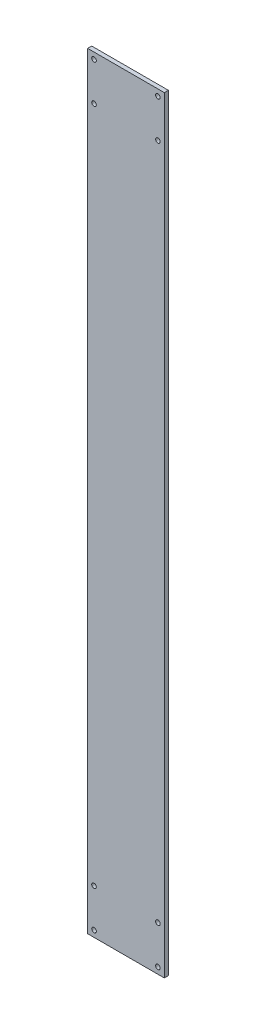
ISO-10303-21;
HEADER;
FILE_DESCRIPTION(('STEP AP214'),'2;1');
FILE_NAME('part.step','',(''),(''),'','','');
FILE_SCHEMA(('AUTOMOTIVE_DESIGN { 1 0 10303 214 1 1 1 1 }'));
ENDSEC;
DATA;
#1=APPLICATION_CONTEXT('core data for automotive mechanical design processes');
#2=APPLICATION_PROTOCOL_DEFINITION('international standard','automotive_design',2000,#1);
#3=PRODUCT_CONTEXT('',#1,'mechanical');
#4=PRODUCT('Part','Part','',(#3));
#5=PRODUCT_RELATED_PRODUCT_CATEGORY('part','',(#4));
#6=PRODUCT_DEFINITION_FORMATION('','',#4);
#7=PRODUCT_DEFINITION_CONTEXT('part definition',#1,'design');
#8=PRODUCT_DEFINITION('design','',#6,#7);
#9=PRODUCT_DEFINITION_SHAPE('','',#8);
#10=(LENGTH_UNIT() NAMED_UNIT(*) SI_UNIT(.MILLI.,.METRE.));
#11=(NAMED_UNIT(*) PLANE_ANGLE_UNIT() SI_UNIT($,.RADIAN.));
#12=(NAMED_UNIT(*) SI_UNIT($,.STERADIAN.) SOLID_ANGLE_UNIT());
#13=UNCERTAINTY_MEASURE_WITH_UNIT(LENGTH_MEASURE(1.E-05),#10,'distance_accuracy_value','');
#14=(GEOMETRIC_REPRESENTATION_CONTEXT(3) GLOBAL_UNCERTAINTY_ASSIGNED_CONTEXT((#13)) GLOBAL_UNIT_ASSIGNED_CONTEXT((#10,
#11,#12)) REPRESENTATION_CONTEXT('',''));
#15=CARTESIAN_POINT('',(0.,0.,0.));
#16=DIRECTION('',(0.,0.,1.));
#17=DIRECTION('',(1.,0.,0.));
#18=AXIS2_PLACEMENT_3D('',#15,#16,#17);
#19=CARTESIAN_POINT('',(30.,300.,3.175));
#20=DIRECTION('',(-1.,0.,0.));
#21=DIRECTION('',(0.,-1.,0.));
#22=AXIS2_PLACEMENT_3D('',#19,#20,#21);
#23=PLANE('',#22);
#24=DIRECTION('',(0.,1.,0.));
#25=VECTOR('',#24,1.);
#26=CARTESIAN_POINT('',(30.,300.,0.));
#27=LINE('',#26,#25);
#28=CARTESIAN_POINT('',(30.,-300.,0.));
#29=VERTEX_POINT('',#28);
#30=CARTESIAN_POINT('',(30.,300.,0.));
#31=VERTEX_POINT('',#30);
#32=EDGE_CURVE('E111',#29,#31,#27,.T.);
#33=ORIENTED_EDGE('',*,*,#32,.T.);
#34=DIRECTION('',(0.,0.,-1.));
#35=VECTOR('',#34,1.);
#36=CARTESIAN_POINT('',(30.,300.,3.175));
#37=LINE('',#36,#35);
#38=CARTESIAN_POINT('',(30.,300.,3.175));
#39=VERTEX_POINT('',#38);
#40=EDGE_CURVE('E11',#39,#31,#37,.T.);
#41=ORIENTED_EDGE('',*,*,#40,.F.);
#42=DIRECTION('',(0.,1.,0.));
#43=VECTOR('',#42,1.);
#44=CARTESIAN_POINT('',(30.,300.,3.175));
#45=LINE('',#44,#43);
#46=CARTESIAN_POINT('',(30.,-300.,3.175));
#47=VERTEX_POINT('',#46);
#48=EDGE_CURVE('E94',#47,#39,#45,.T.);
#49=ORIENTED_EDGE('',*,*,#48,.F.);
#50=DIRECTION('',(0.,0.,-1.));
#51=VECTOR('',#50,1.);
#52=CARTESIAN_POINT('',(30.,-300.,3.175));
#53=LINE('',#52,#51);
#54=EDGE_CURVE('E107',#47,#29,#53,.T.);
#55=ORIENTED_EDGE('',*,*,#54,.T.);
#56=EDGE_LOOP('',(#33,#41,#49,#55));
#57=FACE_BOUND('',#56,.T.);
#58=ADVANCED_FACE('F37',(#57),#23,.F.);
#59=CARTESIAN_POINT('',(-30.,300.,3.175));
#60=DIRECTION('',(0.,-1.,0.));
#61=DIRECTION('',(0.,0.,-1.));
#62=AXIS2_PLACEMENT_3D('',#59,#60,#61);
#63=PLANE('',#62);
#64=DIRECTION('',(-1.,0.,0.));
#65=VECTOR('',#64,1.);
#66=CARTESIAN_POINT('',(-30.,300.,0.));
#67=LINE('',#66,#65);
#68=CARTESIAN_POINT('',(-30.,300.,0.));
#69=VERTEX_POINT('',#68);
#70=EDGE_CURVE('E98',#31,#69,#67,.T.);
#71=ORIENTED_EDGE('',*,*,#70,.T.);
#72=DIRECTION('',(0.,0.,-1.));
#73=VECTOR('',#72,1.);
#74=CARTESIAN_POINT('',(-30.,300.,3.175));
#75=LINE('',#74,#73);
#76=CARTESIAN_POINT('',(-30.,300.,3.175));
#77=VERTEX_POINT('',#76);
#78=EDGE_CURVE('E46',#77,#69,#75,.T.);
#79=ORIENTED_EDGE('',*,*,#78,.F.);
#80=DIRECTION('',(-1.,0.,0.));
#81=VECTOR('',#80,1.);
#82=CARTESIAN_POINT('',(-30.,300.,3.175));
#83=LINE('',#82,#81);
#84=EDGE_CURVE('E89',#39,#77,#83,.T.);
#85=ORIENTED_EDGE('',*,*,#84,.F.);
#86=ORIENTED_EDGE('',*,*,#40,.T.);
#87=EDGE_LOOP('',(#71,#79,#85,#86));
#88=FACE_BOUND('',#87,.T.);
#89=ADVANCED_FACE('F97',(#88),#63,.F.);
#90=CARTESIAN_POINT('',(-30.,300.,3.175));
#91=DIRECTION('',(1.,0.,0.));
#92=DIRECTION('',(0.,1.,0.));
#93=AXIS2_PLACEMENT_3D('',#90,#91,#92);
#94=PLANE('',#93);
#95=DIRECTION('',(0.,-1.,0.));
#96=VECTOR('',#95,1.);
#97=CARTESIAN_POINT('',(-30.,300.,0.));
#98=LINE('',#97,#96);
#99=CARTESIAN_POINT('',(-30.,-300.,0.));
#100=VERTEX_POINT('',#99);
#101=EDGE_CURVE('E76',#69,#100,#98,.T.);
#102=ORIENTED_EDGE('',*,*,#101,.T.);
#103=DIRECTION('',(0.,0.,-1.));
#104=VECTOR('',#103,1.);
#105=CARTESIAN_POINT('',(-30.,-300.,3.175));
#106=LINE('',#105,#104);
#107=CARTESIAN_POINT('',(-30.,-300.,3.175));
#108=VERTEX_POINT('',#107);
#109=EDGE_CURVE('E99',#108,#100,#106,.T.);
#110=ORIENTED_EDGE('',*,*,#109,.F.);
#111=DIRECTION('',(0.,-1.,0.));
#112=VECTOR('',#111,1.);
#113=CARTESIAN_POINT('',(-30.,300.,3.175));
#114=LINE('',#113,#112);
#115=EDGE_CURVE('E92',#77,#108,#114,.T.);
#116=ORIENTED_EDGE('',*,*,#115,.F.);
#117=ORIENTED_EDGE('',*,*,#78,.T.);
#118=EDGE_LOOP('',(#102,#110,#116,#117));
#119=FACE_BOUND('',#118,.T.);
#120=ADVANCED_FACE('F101',(#119),#94,.F.);
#121=CARTESIAN_POINT('',(-30.,-300.,3.175));
#122=DIRECTION('',(0.,1.,0.));
#123=DIRECTION('',(0.,0.,1.));
#124=AXIS2_PLACEMENT_3D('',#121,#122,#123);
#125=PLANE('',#124);
#126=DIRECTION('',(1.,0.,0.));
#127=VECTOR('',#126,1.);
#128=CARTESIAN_POINT('',(-30.,-300.,0.));
#129=LINE('',#128,#127);
#130=EDGE_CURVE('E82',#100,#29,#129,.T.);
#131=ORIENTED_EDGE('',*,*,#130,.T.);
#132=ORIENTED_EDGE('',*,*,#54,.F.);
#133=DIRECTION('',(1.,0.,0.));
#134=VECTOR('',#133,1.);
#135=CARTESIAN_POINT('',(-30.,-300.,3.175));
#136=LINE('',#135,#134);
#137=EDGE_CURVE('E57',#108,#47,#136,.T.);
#138=ORIENTED_EDGE('',*,*,#137,.F.);
#139=ORIENTED_EDGE('',*,*,#109,.T.);
#140=EDGE_LOOP('',(#131,#132,#138,#139));
#141=FACE_BOUND('',#140,.T.);
#142=ADVANCED_FACE('F203',(#141),#125,.F.);
#143=CARTESIAN_POINT('',(0.,0.,3.175));
#144=DIRECTION('',(0.,0.,1.));
#145=DIRECTION('',(1.,0.,0.));
#146=AXIS2_PLACEMENT_3D('',#143,#144,#145);
#147=PLANE('',#146);
#148=CARTESIAN_POINT('',(25.,-295.,3.175));
#149=DIRECTION('',(0.,0.,1.));
#150=DIRECTION('',(1.,0.,0.));
#151=AXIS2_PLACEMENT_3D('',#148,#149,#150);
#152=CIRCLE('',#151,1.79999999999999);
#153=CARTESIAN_POINT('',(26.8,-295.,3.175));
#154=VERTEX_POINT('',#153);
#155=EDGE_CURVE('E157',#154,#154,#152,.T.);
#156=ORIENTED_EDGE('',*,*,#155,.F.);
#157=EDGE_LOOP('',(#156));
#158=FACE_BOUND('',#157,.T.);
#159=CARTESIAN_POINT('',(-25.,-265.,3.175));
#160=DIRECTION('',(0.,0.,1.));
#161=DIRECTION('',(1.,0.,0.));
#162=AXIS2_PLACEMENT_3D('',#159,#160,#161);
#163=CIRCLE('',#162,1.79999999999999);
#164=CARTESIAN_POINT('',(-23.2,-265.,3.175));
#165=VERTEX_POINT('',#164);
#166=EDGE_CURVE('E143',#165,#165,#163,.T.);
#167=ORIENTED_EDGE('',*,*,#166,.F.);
#168=EDGE_LOOP('',(#167));
#169=FACE_BOUND('',#168,.T.);
#170=CARTESIAN_POINT('',(-25.,-295.,3.175));
#171=DIRECTION('',(0.,0.,1.));
#172=DIRECTION('',(1.,0.,0.));
#173=AXIS2_PLACEMENT_3D('',#170,#171,#172);
#174=CIRCLE('',#173,1.79999999999999);
#175=CARTESIAN_POINT('',(-23.2,-295.,3.175));
#176=VERTEX_POINT('',#175);
#177=EDGE_CURVE('E142',#176,#176,#174,.T.);
#178=ORIENTED_EDGE('',*,*,#177,.F.);
#179=EDGE_LOOP('',(#178));
#180=FACE_BOUND('',#179,.T.);
#181=CARTESIAN_POINT('',(25.,-265.,3.175));
#182=DIRECTION('',(0.,0.,1.));
#183=DIRECTION('',(1.,0.,0.));
#184=AXIS2_PLACEMENT_3D('',#181,#182,#183);
#185=CIRCLE('',#184,1.79999999999999);
#186=CARTESIAN_POINT('',(26.8,-265.,3.175));
#187=VERTEX_POINT('',#186);
#188=EDGE_CURVE('E138',#187,#187,#185,.T.);
#189=ORIENTED_EDGE('',*,*,#188,.F.);
#190=EDGE_LOOP('',(#189));
#191=FACE_BOUND('',#190,.T.);
#192=CARTESIAN_POINT('',(-25.,265.,3.175));
#193=DIRECTION('',(0.,0.,1.));
#194=DIRECTION('',(1.,0.,0.));
#195=AXIS2_PLACEMENT_3D('',#192,#193,#194);
#196=CIRCLE('',#195,1.79999999999999);
#197=CARTESIAN_POINT('',(-23.2,265.,3.175));
#198=VERTEX_POINT('',#197);
#199=EDGE_CURVE('E134',#198,#198,#196,.T.);
#200=ORIENTED_EDGE('',*,*,#199,.F.);
#201=EDGE_LOOP('',(#200));
#202=FACE_BOUND('',#201,.T.);
#203=CARTESIAN_POINT('',(-25.,295.,3.175));
#204=DIRECTION('',(0.,0.,1.));
#205=DIRECTION('',(1.,0.,0.));
#206=AXIS2_PLACEMENT_3D('',#203,#204,#205);
#207=CIRCLE('',#206,1.79999999999999);
#208=CARTESIAN_POINT('',(-23.2,295.,3.175));
#209=VERTEX_POINT('',#208);
#210=EDGE_CURVE('E133',#209,#209,#207,.T.);
#211=ORIENTED_EDGE('',*,*,#210,.F.);
#212=EDGE_LOOP('',(#211));
#213=FACE_BOUND('',#212,.T.);
#214=CARTESIAN_POINT('',(25.,295.,3.175));
#215=DIRECTION('',(0.,0.,1.));
#216=DIRECTION('',(1.,0.,0.));
#217=AXIS2_PLACEMENT_3D('',#214,#215,#216);
#218=CIRCLE('',#217,1.79999999999999);
#219=CARTESIAN_POINT('',(26.8,295.,3.175));
#220=VERTEX_POINT('',#219);
#221=EDGE_CURVE('E129',#220,#220,#218,.T.);
#222=ORIENTED_EDGE('',*,*,#221,.F.);
#223=EDGE_LOOP('',(#222));
#224=FACE_BOUND('',#223,.T.);
#225=CARTESIAN_POINT('',(25.,265.,3.175));
#226=DIRECTION('',(0.,0.,1.));
#227=DIRECTION('',(1.,0.,0.));
#228=AXIS2_PLACEMENT_3D('',#225,#226,#227);
#229=CIRCLE('',#228,1.79999999999999);
#230=CARTESIAN_POINT('',(26.8,265.,3.175));
#231=VERTEX_POINT('',#230);
#232=EDGE_CURVE('E128',#231,#231,#229,.T.);
#233=ORIENTED_EDGE('',*,*,#232,.F.);
#234=EDGE_LOOP('',(#233));
#235=FACE_BOUND('',#234,.T.);
#236=ORIENTED_EDGE('',*,*,#48,.T.);
#237=ORIENTED_EDGE('',*,*,#84,.T.);
#238=ORIENTED_EDGE('',*,*,#115,.T.);
#239=ORIENTED_EDGE('',*,*,#137,.T.);
#240=EDGE_LOOP('',(#236,#237,#238,#239));
#241=FACE_BOUND('',#240,.T.);
#242=ADVANCED_FACE('F90',(#158,#169,#180,#191,#202,#213,#224,#235,#241),#147,.T.);
#243=CARTESIAN_POINT('',(0.,0.,0.));
#244=DIRECTION('',(0.,0.,1.));
#245=DIRECTION('',(1.,0.,0.));
#246=AXIS2_PLACEMENT_3D('',#243,#244,#245);
#247=PLANE('',#246);
#248=CARTESIAN_POINT('',(25.,-295.,0.));
#249=DIRECTION('',(0.,0.,1.));
#250=DIRECTION('',(1.,0.,0.));
#251=AXIS2_PLACEMENT_3D('',#248,#249,#250);
#252=CIRCLE('',#251,1.79999999999999);
#253=CARTESIAN_POINT('',(26.8,-295.,0.));
#254=VERTEX_POINT('',#253);
#255=EDGE_CURVE('E40',#254,#254,#252,.T.);
#256=ORIENTED_EDGE('',*,*,#255,.T.);
#257=EDGE_LOOP('',(#256));
#258=FACE_BOUND('',#257,.T.);
#259=CARTESIAN_POINT('',(-25.,-265.,0.));
#260=DIRECTION('',(0.,0.,1.));
#261=DIRECTION('',(1.,0.,0.));
#262=AXIS2_PLACEMENT_3D('',#259,#260,#261);
#263=CIRCLE('',#262,1.79999999999999);
#264=CARTESIAN_POINT('',(-23.2,-265.,0.));
#265=VERTEX_POINT('',#264);
#266=EDGE_CURVE('E139',#265,#265,#263,.T.);
#267=ORIENTED_EDGE('',*,*,#266,.T.);
#268=EDGE_LOOP('',(#267));
#269=FACE_BOUND('',#268,.T.);
#270=CARTESIAN_POINT('',(-25.,-295.,0.));
#271=DIRECTION('',(0.,0.,1.));
#272=DIRECTION('',(1.,0.,0.));
#273=AXIS2_PLACEMENT_3D('',#270,#271,#272);
#274=CIRCLE('',#273,1.79999999999999);
#275=CARTESIAN_POINT('',(-23.2,-295.,0.));
#276=VERTEX_POINT('',#275);
#277=EDGE_CURVE('E148',#276,#276,#274,.T.);
#278=ORIENTED_EDGE('',*,*,#277,.T.);
#279=EDGE_LOOP('',(#278));
#280=FACE_BOUND('',#279,.T.);
#281=CARTESIAN_POINT('',(25.,-265.,0.));
#282=DIRECTION('',(0.,0.,1.));
#283=DIRECTION('',(1.,0.,0.));
#284=AXIS2_PLACEMENT_3D('',#281,#282,#283);
#285=CIRCLE('',#284,1.79999999999999);
#286=CARTESIAN_POINT('',(26.8,-265.,0.));
#287=VERTEX_POINT('',#286);
#288=EDGE_CURVE('E135',#287,#287,#285,.T.);
#289=ORIENTED_EDGE('',*,*,#288,.T.);
#290=EDGE_LOOP('',(#289));
#291=FACE_BOUND('',#290,.T.);
#292=CARTESIAN_POINT('',(-25.,265.,0.));
#293=DIRECTION('',(0.,0.,1.));
#294=DIRECTION('',(1.,0.,0.));
#295=AXIS2_PLACEMENT_3D('',#292,#293,#294);
#296=CIRCLE('',#295,1.79999999999999);
#297=CARTESIAN_POINT('',(-23.2,265.,0.));
#298=VERTEX_POINT('',#297);
#299=EDGE_CURVE('E130',#298,#298,#296,.T.);
#300=ORIENTED_EDGE('',*,*,#299,.T.);
#301=EDGE_LOOP('',(#300));
#302=FACE_BOUND('',#301,.T.);
#303=CARTESIAN_POINT('',(-25.,295.,0.));
#304=DIRECTION('',(0.,0.,1.));
#305=DIRECTION('',(1.,0.,0.));
#306=AXIS2_PLACEMENT_3D('',#303,#304,#305);
#307=CIRCLE('',#306,1.79999999999999);
#308=CARTESIAN_POINT('',(-23.2,295.,0.));
#309=VERTEX_POINT('',#308);
#310=EDGE_CURVE('E169',#309,#309,#307,.T.);
#311=ORIENTED_EDGE('',*,*,#310,.T.);
#312=EDGE_LOOP('',(#311));
#313=FACE_BOUND('',#312,.T.);
#314=CARTESIAN_POINT('',(25.,295.,0.));
#315=DIRECTION('',(0.,0.,1.));
#316=DIRECTION('',(1.,0.,0.));
#317=AXIS2_PLACEMENT_3D('',#314,#315,#316);
#318=CIRCLE('',#317,1.79999999999999);
#319=CARTESIAN_POINT('',(26.8,295.,0.));
#320=VERTEX_POINT('',#319);
#321=EDGE_CURVE('E125',#320,#320,#318,.T.);
#322=ORIENTED_EDGE('',*,*,#321,.T.);
#323=EDGE_LOOP('',(#322));
#324=FACE_BOUND('',#323,.T.);
#325=CARTESIAN_POINT('',(25.,265.,0.));
#326=DIRECTION('',(0.,0.,1.));
#327=DIRECTION('',(1.,0.,0.));
#328=AXIS2_PLACEMENT_3D('',#325,#326,#327);
#329=CIRCLE('',#328,1.79999999999999);
#330=CARTESIAN_POINT('',(26.8,265.,0.));
#331=VERTEX_POINT('',#330);
#332=EDGE_CURVE('E115',#331,#331,#329,.T.);
#333=ORIENTED_EDGE('',*,*,#332,.T.);
#334=EDGE_LOOP('',(#333));
#335=FACE_BOUND('',#334,.T.);
#336=ORIENTED_EDGE('',*,*,#32,.F.);
#337=ORIENTED_EDGE('',*,*,#130,.F.);
#338=ORIENTED_EDGE('',*,*,#101,.F.);
#339=ORIENTED_EDGE('',*,*,#70,.F.);
#340=EDGE_LOOP('',(#336,#337,#338,#339));
#341=FACE_BOUND('',#340,.T.);
#342=ADVANCED_FACE('F179',(#258,#269,#280,#291,#302,#313,#324,#335,#341),#247,.F.);
#343=CARTESIAN_POINT('',(25.,265.,3.175));
#344=DIRECTION('',(0.,0.,1.));
#345=DIRECTION('',(1.,0.,0.));
#346=AXIS2_PLACEMENT_3D('',#343,#344,#345);
#347=CYLINDRICAL_SURFACE('',#346,1.79999999999999);
#348=ORIENTED_EDGE('',*,*,#232,.T.);
#349=EDGE_LOOP('',(#348));
#350=FACE_BOUND('',#349,.T.);
#351=ORIENTED_EDGE('',*,*,#332,.F.);
#352=EDGE_LOOP('',(#351));
#353=FACE_BOUND('',#352,.T.);
#354=ADVANCED_FACE('F182',(#350,#353),#347,.F.);
#355=CARTESIAN_POINT('',(25.,295.,3.175));
#356=DIRECTION('',(0.,0.,1.));
#357=DIRECTION('',(1.,0.,0.));
#358=AXIS2_PLACEMENT_3D('',#355,#356,#357);
#359=CYLINDRICAL_SURFACE('',#358,1.79999999999999);
#360=ORIENTED_EDGE('',*,*,#221,.T.);
#361=EDGE_LOOP('',(#360));
#362=FACE_BOUND('',#361,.T.);
#363=ORIENTED_EDGE('',*,*,#321,.F.);
#364=EDGE_LOOP('',(#363));
#365=FACE_BOUND('',#364,.T.);
#366=ADVANCED_FACE('F184',(#362,#365),#359,.F.);
#367=CARTESIAN_POINT('',(-25.,295.,3.175));
#368=DIRECTION('',(0.,0.,1.));
#369=DIRECTION('',(1.,0.,0.));
#370=AXIS2_PLACEMENT_3D('',#367,#368,#369);
#371=CYLINDRICAL_SURFACE('',#370,1.79999999999999);
#372=ORIENTED_EDGE('',*,*,#210,.T.);
#373=EDGE_LOOP('',(#372));
#374=FACE_BOUND('',#373,.T.);
#375=ORIENTED_EDGE('',*,*,#310,.F.);
#376=EDGE_LOOP('',(#375));
#377=FACE_BOUND('',#376,.T.);
#378=ADVANCED_FACE('F191',(#374,#377),#371,.F.);
#379=CARTESIAN_POINT('',(-25.,265.,3.175));
#380=DIRECTION('',(0.,0.,1.));
#381=DIRECTION('',(1.,0.,0.));
#382=AXIS2_PLACEMENT_3D('',#379,#380,#381);
#383=CYLINDRICAL_SURFACE('',#382,1.79999999999999);
#384=ORIENTED_EDGE('',*,*,#199,.T.);
#385=EDGE_LOOP('',(#384));
#386=FACE_BOUND('',#385,.T.);
#387=ORIENTED_EDGE('',*,*,#299,.F.);
#388=EDGE_LOOP('',(#387));
#389=FACE_BOUND('',#388,.T.);
#390=ADVANCED_FACE('F257',(#386,#389),#383,.F.);
#391=CARTESIAN_POINT('',(25.,-265.,3.175));
#392=DIRECTION('',(0.,0.,1.));
#393=DIRECTION('',(1.,0.,0.));
#394=AXIS2_PLACEMENT_3D('',#391,#392,#393);
#395=CYLINDRICAL_SURFACE('',#394,1.79999999999999);
#396=ORIENTED_EDGE('',*,*,#188,.T.);
#397=EDGE_LOOP('',(#396));
#398=FACE_BOUND('',#397,.T.);
#399=ORIENTED_EDGE('',*,*,#288,.F.);
#400=EDGE_LOOP('',(#399));
#401=FACE_BOUND('',#400,.T.);
#402=ADVANCED_FACE('F266',(#398,#401),#395,.F.);
#403=CARTESIAN_POINT('',(-25.,-295.,3.175));
#404=DIRECTION('',(0.,0.,1.));
#405=DIRECTION('',(1.,0.,0.));
#406=AXIS2_PLACEMENT_3D('',#403,#404,#405);
#407=CYLINDRICAL_SURFACE('',#406,1.79999999999999);
#408=ORIENTED_EDGE('',*,*,#177,.T.);
#409=EDGE_LOOP('',(#408));
#410=FACE_BOUND('',#409,.T.);
#411=ORIENTED_EDGE('',*,*,#277,.F.);
#412=EDGE_LOOP('',(#411));
#413=FACE_BOUND('',#412,.T.);
#414=ADVANCED_FACE('F275',(#410,#413),#407,.F.);
#415=CARTESIAN_POINT('',(-25.,-265.,3.175));
#416=DIRECTION('',(0.,0.,1.));
#417=DIRECTION('',(1.,0.,0.));
#418=AXIS2_PLACEMENT_3D('',#415,#416,#417);
#419=CYLINDRICAL_SURFACE('',#418,1.79999999999999);
#420=ORIENTED_EDGE('',*,*,#166,.T.);
#421=EDGE_LOOP('',(#420));
#422=FACE_BOUND('',#421,.T.);
#423=ORIENTED_EDGE('',*,*,#266,.F.);
#424=EDGE_LOOP('',(#423));
#425=FACE_BOUND('',#424,.T.);
#426=ADVANCED_FACE('F284',(#422,#425),#419,.F.);
#427=CARTESIAN_POINT('',(25.,-295.,3.175));
#428=DIRECTION('',(0.,0.,1.));
#429=DIRECTION('',(1.,0.,0.));
#430=AXIS2_PLACEMENT_3D('',#427,#428,#429);
#431=CYLINDRICAL_SURFACE('',#430,1.79999999999999);
#432=ORIENTED_EDGE('',*,*,#155,.T.);
#433=EDGE_LOOP('',(#432));
#434=FACE_BOUND('',#433,.T.);
#435=ORIENTED_EDGE('',*,*,#255,.F.);
#436=EDGE_LOOP('',(#435));
#437=FACE_BOUND('',#436,.T.);
#438=ADVANCED_FACE('F293',(#434,#437),#431,.F.);
#439=CLOSED_SHELL('',(#58,#89,#120,#142,#242,#342,#354,#366,#378,#390,#402,#414,#426,#438));
#440=MANIFOLD_SOLID_BREP('B2',#439);
#441=ADVANCED_BREP_SHAPE_REPRESENTATION('',(#18,#440),#14);
#442=SHAPE_DEFINITION_REPRESENTATION(#9,#441);
ENDSEC;
END-ISO-10303-21;
